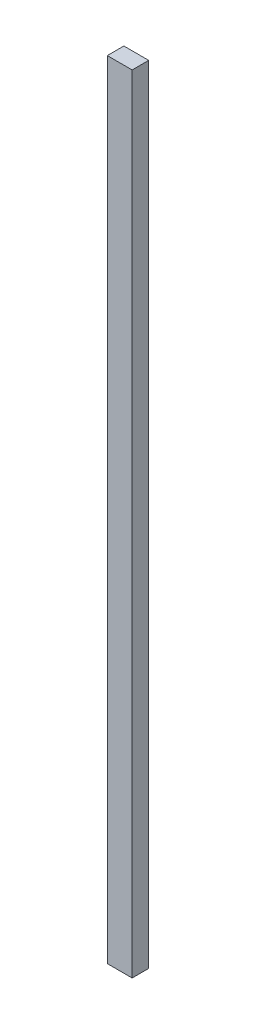
ISO-10303-21;
HEADER;
FILE_DESCRIPTION(('STEP AP214'),'2;1');
FILE_NAME('part.step','',(''),(''),'','','');
FILE_SCHEMA(('AUTOMOTIVE_DESIGN { 1 0 10303 214 1 1 1 1 }'));
ENDSEC;
DATA;
#1=APPLICATION_CONTEXT('core data for automotive mechanical design processes');
#2=APPLICATION_PROTOCOL_DEFINITION('international standard','automotive_design',2000,#1);
#3=PRODUCT_CONTEXT('',#1,'mechanical');
#4=PRODUCT('Part','Part','',(#3));
#5=PRODUCT_RELATED_PRODUCT_CATEGORY('part','',(#4));
#6=PRODUCT_DEFINITION_FORMATION('','',#4);
#7=PRODUCT_DEFINITION_CONTEXT('part definition',#1,'design');
#8=PRODUCT_DEFINITION('design','',#6,#7);
#9=PRODUCT_DEFINITION_SHAPE('','',#8);
#10=(LENGTH_UNIT() NAMED_UNIT(*) SI_UNIT(.MILLI.,.METRE.));
#11=(NAMED_UNIT(*) PLANE_ANGLE_UNIT() SI_UNIT($,.RADIAN.));
#12=(NAMED_UNIT(*) SI_UNIT($,.STERADIAN.) SOLID_ANGLE_UNIT());
#13=UNCERTAINTY_MEASURE_WITH_UNIT(LENGTH_MEASURE(1.E-05),#10,'distance_accuracy_value','');
#14=(GEOMETRIC_REPRESENTATION_CONTEXT(3) GLOBAL_UNCERTAINTY_ASSIGNED_CONTEXT((#13)) GLOBAL_UNIT_ASSIGNED_CONTEXT((#10,
#11,#12)) REPRESENTATION_CONTEXT('',''));
#15=CARTESIAN_POINT('',(0.,0.,0.));
#16=DIRECTION('',(0.,0.,1.));
#17=DIRECTION('',(1.,0.,0.));
#18=AXIS2_PLACEMENT_3D('',#15,#16,#17);
#19=CARTESIAN_POINT('',(-6.00000000000007,604.13152704335,-49.3065730089409));
#20=DIRECTION('',(1.,0.,0.));
#21=DIRECTION('',(0.,1.,0.));
#22=AXIS2_PLACEMENT_3D('',#19,#20,#21);
#23=PLANE('',#22);
#24=DIRECTION('',(0.,1.,0.));
#25=VECTOR('',#24,1.);
#26=CARTESIAN_POINT('',(-6.00000000000007,604.13152704335,-41.3065730089409));
#27=LINE('',#26,#25);
#28=CARTESIAN_POINT('',(-6.00000000000009,224.631527043195,-41.306573008941));
#29=VERTEX_POINT('',#28);
#30=CARTESIAN_POINT('',(-6.00000000000007,604.13152704335,-41.3065730089409));
#31=VERTEX_POINT('',#30);
#32=EDGE_CURVE('E96',#29,#31,#27,.T.);
#33=ORIENTED_EDGE('',*,*,#32,.T.);
#34=DIRECTION('',(0.,0.,1.));
#35=VECTOR('',#34,1.);
#36=CARTESIAN_POINT('',(-6.00000000000007,604.13152704335,-49.3065730089409));
#37=LINE('',#36,#35);
#38=CARTESIAN_POINT('',(-6.00000000000007,604.13152704335,-49.3065730089409));
#39=VERTEX_POINT('',#38);
#40=EDGE_CURVE('E11',#39,#31,#37,.T.);
#41=ORIENTED_EDGE('',*,*,#40,.F.);
#42=DIRECTION('',(0.,1.,0.));
#43=VECTOR('',#42,1.);
#44=CARTESIAN_POINT('',(-6.00000000000007,604.13152704335,-49.3065730089409));
#45=LINE('',#44,#43);
#46=CARTESIAN_POINT('',(-6.00000000000009,224.631527043195,-49.306573008941));
#47=VERTEX_POINT('',#46);
#48=EDGE_CURVE('E84',#47,#39,#45,.T.);
#49=ORIENTED_EDGE('',*,*,#48,.F.);
#50=DIRECTION('',(0.,0.,1.));
#51=VECTOR('',#50,1.);
#52=CARTESIAN_POINT('',(-6.00000000000009,224.631527043195,-49.306573008941));
#53=LINE('',#52,#51);
#54=EDGE_CURVE('E92',#47,#29,#53,.T.);
#55=ORIENTED_EDGE('',*,*,#54,.T.);
#56=EDGE_LOOP('',(#33,#41,#49,#55));
#57=FACE_BOUND('',#56,.T.);
#58=ADVANCED_FACE('F33',(#57),#23,.F.);
#59=CARTESIAN_POINT('',(5.99999999999993,604.13152704335,-49.3065730089409));
#60=DIRECTION('',(0.,-1.,0.));
#61=DIRECTION('',(0.,0.,-1.));
#62=AXIS2_PLACEMENT_3D('',#59,#60,#61);
#63=PLANE('',#62);
#64=DIRECTION('',(1.,0.,0.));
#65=VECTOR('',#64,1.);
#66=CARTESIAN_POINT('',(5.99999999999993,604.13152704335,-41.3065730089409));
#67=LINE('',#66,#65);
#68=CARTESIAN_POINT('',(5.99999999999993,604.13152704335,-41.3065730089409));
#69=VERTEX_POINT('',#68);
#70=EDGE_CURVE('E88',#31,#69,#67,.T.);
#71=ORIENTED_EDGE('',*,*,#70,.T.);
#72=DIRECTION('',(0.,0.,1.));
#73=VECTOR('',#72,1.);
#74=CARTESIAN_POINT('',(5.99999999999993,604.13152704335,-49.3065730089409));
#75=LINE('',#74,#73);
#76=CARTESIAN_POINT('',(5.99999999999993,604.13152704335,-49.3065730089409));
#77=VERTEX_POINT('',#76);
#78=EDGE_CURVE('E41',#77,#69,#75,.T.);
#79=ORIENTED_EDGE('',*,*,#78,.F.);
#80=DIRECTION('',(1.,0.,0.));
#81=VECTOR('',#80,1.);
#82=CARTESIAN_POINT('',(5.99999999999993,604.13152704335,-49.3065730089409));
#83=LINE('',#82,#81);
#84=EDGE_CURVE('E79',#39,#77,#83,.T.);
#85=ORIENTED_EDGE('',*,*,#84,.F.);
#86=ORIENTED_EDGE('',*,*,#40,.T.);
#87=EDGE_LOOP('',(#71,#79,#85,#86));
#88=FACE_BOUND('',#87,.T.);
#89=ADVANCED_FACE('F87',(#88),#63,.F.);
#90=CARTESIAN_POINT('',(5.99999999999993,604.13152704335,-49.3065730089409));
#91=DIRECTION('',(-1.,0.,0.));
#92=DIRECTION('',(0.,-1.,0.));
#93=AXIS2_PLACEMENT_3D('',#90,#91,#92);
#94=PLANE('',#93);
#95=DIRECTION('',(0.,-1.,0.));
#96=VECTOR('',#95,1.);
#97=CARTESIAN_POINT('',(5.99999999999993,604.13152704335,-41.3065730089409));
#98=LINE('',#97,#96);
#99=CARTESIAN_POINT('',(5.99999999999991,224.631527043195,-41.306573008941));
#100=VERTEX_POINT('',#99);
#101=EDGE_CURVE('E66',#69,#100,#98,.T.);
#102=ORIENTED_EDGE('',*,*,#101,.T.);
#103=DIRECTION('',(0.,0.,1.));
#104=VECTOR('',#103,1.);
#105=CARTESIAN_POINT('',(5.99999999999991,224.631527043195,-49.306573008941));
#106=LINE('',#105,#104);
#107=CARTESIAN_POINT('',(5.99999999999991,224.631527043195,-49.306573008941));
#108=VERTEX_POINT('',#107);
#109=EDGE_CURVE('E89',#108,#100,#106,.T.);
#110=ORIENTED_EDGE('',*,*,#109,.F.);
#111=DIRECTION('',(0.,-1.,0.));
#112=VECTOR('',#111,1.);
#113=CARTESIAN_POINT('',(5.99999999999993,604.13152704335,-49.3065730089409));
#114=LINE('',#113,#112);
#115=EDGE_CURVE('E82',#77,#108,#114,.T.);
#116=ORIENTED_EDGE('',*,*,#115,.F.);
#117=ORIENTED_EDGE('',*,*,#78,.T.);
#118=EDGE_LOOP('',(#102,#110,#116,#117));
#119=FACE_BOUND('',#118,.T.);
#120=ADVANCED_FACE('F90',(#119),#94,.F.);
#121=CARTESIAN_POINT('',(5.99999999999991,224.631527043195,-49.306573008941));
#122=DIRECTION('',(0.,1.,0.));
#123=DIRECTION('',(0.,0.,1.));
#124=AXIS2_PLACEMENT_3D('',#121,#122,#123);
#125=PLANE('',#124);
#126=DIRECTION('',(-1.,0.,0.));
#127=VECTOR('',#126,1.);
#128=CARTESIAN_POINT('',(5.99999999999991,224.631527043195,-41.306573008941));
#129=LINE('',#128,#127);
#130=EDGE_CURVE('E72',#100,#29,#129,.T.);
#131=ORIENTED_EDGE('',*,*,#130,.T.);
#132=ORIENTED_EDGE('',*,*,#54,.F.);
#133=DIRECTION('',(-1.,0.,0.));
#134=VECTOR('',#133,1.);
#135=CARTESIAN_POINT('',(5.99999999999991,224.631527043195,-49.306573008941));
#136=LINE('',#135,#134);
#137=EDGE_CURVE('E49',#108,#47,#136,.T.);
#138=ORIENTED_EDGE('',*,*,#137,.F.);
#139=ORIENTED_EDGE('',*,*,#109,.T.);
#140=EDGE_LOOP('',(#131,#132,#138,#139));
#141=FACE_BOUND('',#140,.T.);
#142=ADVANCED_FACE('F103',(#141),#125,.F.);
#143=CARTESIAN_POINT('',(0.,0.,-49.306573008941));
#144=DIRECTION('',(0.,0.,-1.));
#145=DIRECTION('',(0.,1.,0.));
#146=AXIS2_PLACEMENT_3D('',#143,#144,#145);
#147=PLANE('',#146);
#148=ORIENTED_EDGE('',*,*,#48,.T.);
#149=ORIENTED_EDGE('',*,*,#84,.T.);
#150=ORIENTED_EDGE('',*,*,#115,.T.);
#151=ORIENTED_EDGE('',*,*,#137,.T.);
#152=EDGE_LOOP('',(#148,#149,#150,#151));
#153=FACE_BOUND('',#152,.T.);
#154=ADVANCED_FACE('F80',(#153),#147,.T.);
#155=CARTESIAN_POINT('',(0.,0.,-41.306573008941));
#156=DIRECTION('',(0.,0.,-1.));
#157=DIRECTION('',(0.,1.,0.));
#158=AXIS2_PLACEMENT_3D('',#155,#156,#157);
#159=PLANE('',#158);
#160=ORIENTED_EDGE('',*,*,#32,.F.);
#161=ORIENTED_EDGE('',*,*,#130,.F.);
#162=ORIENTED_EDGE('',*,*,#101,.F.);
#163=ORIENTED_EDGE('',*,*,#70,.F.);
#164=EDGE_LOOP('',(#160,#161,#162,#163));
#165=FACE_BOUND('',#164,.T.);
#166=ADVANCED_FACE('F106',(#165),#159,.F.);
#167=CLOSED_SHELL('',(#58,#89,#120,#142,#154,#166));
#168=MANIFOLD_SOLID_BREP('B2',#167);
#169=ADVANCED_BREP_SHAPE_REPRESENTATION('',(#18,#168),#14);
#170=SHAPE_DEFINITION_REPRESENTATION(#9,#169);
ENDSEC;
END-ISO-10303-21;
